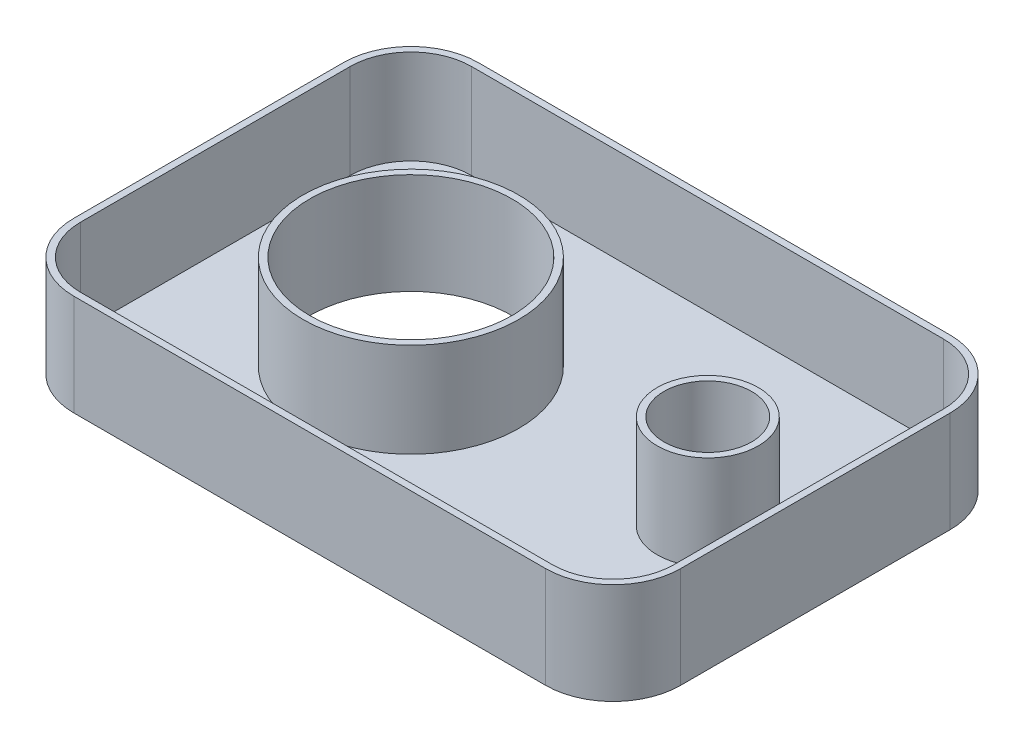
ISO-10303-21;
HEADER;
FILE_DESCRIPTION(('STEP AP214'),'2;1');
FILE_NAME('part.step','',(''),(''),'','','');
FILE_SCHEMA(('AUTOMOTIVE_DESIGN { 1 0 10303 214 1 1 1 1 }'));
ENDSEC;
DATA;
#1=APPLICATION_CONTEXT('core data for automotive mechanical design processes');
#2=APPLICATION_PROTOCOL_DEFINITION('international standard','automotive_design',2000,#1);
#3=PRODUCT_CONTEXT('',#1,'mechanical');
#4=PRODUCT('Part','Part','',(#3));
#5=PRODUCT_RELATED_PRODUCT_CATEGORY('part','',(#4));
#6=PRODUCT_DEFINITION_FORMATION('','',#4);
#7=PRODUCT_DEFINITION_CONTEXT('part definition',#1,'design');
#8=PRODUCT_DEFINITION('design','',#6,#7);
#9=PRODUCT_DEFINITION_SHAPE('','',#8);
#10=(LENGTH_UNIT() NAMED_UNIT(*) SI_UNIT(.MILLI.,.METRE.));
#11=(NAMED_UNIT(*) PLANE_ANGLE_UNIT() SI_UNIT($,.RADIAN.));
#12=(NAMED_UNIT(*) SI_UNIT($,.STERADIAN.) SOLID_ANGLE_UNIT());
#13=UNCERTAINTY_MEASURE_WITH_UNIT(LENGTH_MEASURE(1.E-05),#10,'distance_accuracy_value','');
#14=(GEOMETRIC_REPRESENTATION_CONTEXT(3) GLOBAL_UNCERTAINTY_ASSIGNED_CONTEXT((#13)) GLOBAL_UNIT_ASSIGNED_CONTEXT((#10,
#11,#12)) REPRESENTATION_CONTEXT('',''));
#15=CARTESIAN_POINT('',(0.,0.,0.));
#16=DIRECTION('',(0.,0.,1.));
#17=DIRECTION('',(1.,0.,0.));
#18=AXIS2_PLACEMENT_3D('',#15,#16,#17);
#19=CARTESIAN_POINT('',(0.,30.,0.));
#20=DIRECTION('',(0.,1.,0.));
#21=DIRECTION('',(0.,0.,1.));
#22=AXIS2_PLACEMENT_3D('',#19,#20,#21);
#23=PLANE('',#22);
#24=CARTESIAN_POINT('',(60.,30.,60.));
#25=DIRECTION('',(0.,1.,0.));
#26=DIRECTION('',(0.,0.,1.));
#27=AXIS2_PLACEMENT_3D('',#24,#25,#26);
#28=CIRCLE('',#27,30.);
#29=CARTESIAN_POINT('',(60.,30.,90.));
#30=VERTEX_POINT('',#29);
#31=EDGE_CURVE('E275',#30,#30,#28,.T.);
#32=ORIENTED_EDGE('',*,*,#31,.F.);
#33=EDGE_LOOP('',(#32));
#34=FACE_BOUND('',#33,.T.);
#35=CARTESIAN_POINT('',(60.,30.,60.));
#36=DIRECTION('',(0.,1.,0.));
#37=DIRECTION('',(0.,0.,1.));
#38=AXIS2_PLACEMENT_3D('',#35,#36,#37);
#39=CIRCLE('',#38,32.);
#40=CARTESIAN_POINT('',(60.,30.,92.));
#41=VERTEX_POINT('',#40);
#42=EDGE_CURVE('E201',#41,#41,#39,.T.);
#43=ORIENTED_EDGE('',*,*,#42,.T.);
#44=EDGE_LOOP('',(#43));
#45=FACE_BOUND('',#44,.T.);
#46=ADVANCED_FACE('F43',(#34,#45),#23,.T.);
#47=CARTESIAN_POINT('',(145.,30.,56.9263633620725));
#48=DIRECTION('',(0.,1.,0.));
#49=DIRECTION('',(0.,0.,1.));
#50=AXIS2_PLACEMENT_3D('',#47,#48,#49);
#51=CIRCLE('',#50,13.);
#52=CARTESIAN_POINT('',(145.,30.,69.9263633620725));
#53=VERTEX_POINT('',#52);
#54=EDGE_CURVE('E279',#53,#53,#51,.T.);
#55=ORIENTED_EDGE('',*,*,#54,.F.);
#56=EDGE_LOOP('',(#55));
#57=FACE_BOUND('',#56,.T.);
#58=CARTESIAN_POINT('',(145.,30.,56.9263633620725));
#59=DIRECTION('',(0.,1.,0.));
#60=DIRECTION('',(0.,0.,1.));
#61=AXIS2_PLACEMENT_3D('',#58,#59,#60);
#62=CIRCLE('',#61,15.);
#63=CARTESIAN_POINT('',(145.,30.,71.9263633620725));
#64=VERTEX_POINT('',#63);
#65=EDGE_CURVE('E206',#64,#64,#62,.T.);
#66=ORIENTED_EDGE('',*,*,#65,.T.);
#67=EDGE_LOOP('',(#66));
#68=FACE_BOUND('',#67,.T.);
#69=ADVANCED_FACE('F404',(#57,#68),#23,.T.);
#70=CARTESIAN_POINT('',(0.,30.,0.));
#71=DIRECTION('',(1.,0.,0.));
#72=DIRECTION('',(0.,0.,-1.));
#73=AXIS2_PLACEMENT_3D('',#70,#71,#72);
#74=PLANE('',#73);
#75=DIRECTION('',(0.,0.,1.));
#76=VECTOR('',#75,1.);
#77=CARTESIAN_POINT('',(0.,0.,0.));
#78=LINE('',#77,#76);
#79=CARTESIAN_POINT('',(0.,0.,20.));
#80=VERTEX_POINT('',#79);
#81=CARTESIAN_POINT('',(0.,0.,100.));
#82=VERTEX_POINT('',#81);
#83=EDGE_CURVE('E274',#80,#82,#78,.T.);
#84=ORIENTED_EDGE('',*,*,#83,.T.);
#85=DIRECTION('',(0.,-1.,0.));
#86=VECTOR('',#85,1.);
#87=CARTESIAN_POINT('',(0.,30.,100.));
#88=LINE('',#87,#86);
#89=CARTESIAN_POINT('',(0.,30.,100.));
#90=VERTEX_POINT('',#89);
#91=EDGE_CURVE('E338',#82,#90,#88,.F.);
#92=ORIENTED_EDGE('',*,*,#91,.T.);
#93=DIRECTION('',(0.,0.,1.));
#94=VECTOR('',#93,1.);
#95=CARTESIAN_POINT('',(0.,30.,0.));
#96=LINE('',#95,#94);
#97=CARTESIAN_POINT('',(0.,30.,20.));
#98=VERTEX_POINT('',#97);
#99=EDGE_CURVE('E286',#98,#90,#96,.T.);
#100=ORIENTED_EDGE('',*,*,#99,.F.);
#101=DIRECTION('',(0.,-1.,0.));
#102=VECTOR('',#101,1.);
#103=CARTESIAN_POINT('',(0.,30.,20.));
#104=LINE('',#103,#102);
#105=EDGE_CURVE('E334',#98,#80,#104,.T.);
#106=ORIENTED_EDGE('',*,*,#105,.T.);
#107=EDGE_LOOP('',(#84,#92,#100,#106));
#108=FACE_BOUND('',#107,.T.);
#109=ADVANCED_FACE('F386',(#108),#74,.F.);
#110=CARTESIAN_POINT('',(0.,30.,120.));
#111=DIRECTION('',(0.,0.,-1.));
#112=DIRECTION('',(-1.,0.,0.));
#113=AXIS2_PLACEMENT_3D('',#110,#111,#112);
#114=PLANE('',#113);
#115=DIRECTION('',(1.,0.,0.));
#116=VECTOR('',#115,1.);
#117=CARTESIAN_POINT('',(0.,30.,120.));
#118=LINE('',#117,#116);
#119=CARTESIAN_POINT('',(20.,30.,120.));
#120=VERTEX_POINT('',#119);
#121=CARTESIAN_POINT('',(160.,30.,120.));
#122=VERTEX_POINT('',#121);
#123=EDGE_CURVE('E290',#120,#122,#118,.T.);
#124=ORIENTED_EDGE('',*,*,#123,.F.);
#125=DIRECTION('',(0.,-1.,0.));
#126=VECTOR('',#125,1.);
#127=CARTESIAN_POINT('',(20.,30.,120.));
#128=LINE('',#127,#126);
#129=CARTESIAN_POINT('',(20.,0.,120.));
#130=VERTEX_POINT('',#129);
#131=EDGE_CURVE('E318',#120,#130,#128,.T.);
#132=ORIENTED_EDGE('',*,*,#131,.T.);
#133=DIRECTION('',(1.,0.,0.));
#134=VECTOR('',#133,1.);
#135=CARTESIAN_POINT('',(0.,0.,120.));
#136=LINE('',#135,#134);
#137=CARTESIAN_POINT('',(160.,0.,120.));
#138=VERTEX_POINT('',#137);
#139=EDGE_CURVE('E306',#130,#138,#136,.T.);
#140=ORIENTED_EDGE('',*,*,#139,.T.);
#141=DIRECTION('',(0.,-1.,0.));
#142=VECTOR('',#141,1.);
#143=CARTESIAN_POINT('',(160.,30.,120.));
#144=LINE('',#143,#142);
#145=EDGE_CURVE('E302',#138,#122,#144,.F.);
#146=ORIENTED_EDGE('',*,*,#145,.T.);
#147=EDGE_LOOP('',(#124,#132,#140,#146));
#148=FACE_BOUND('',#147,.T.);
#149=ADVANCED_FACE('F394',(#148),#114,.F.);
#150=CARTESIAN_POINT('',(180.,30.,0.));
#151=DIRECTION('',(-1.,0.,0.));
#152=DIRECTION('',(0.,0.,1.));
#153=AXIS2_PLACEMENT_3D('',#150,#151,#152);
#154=PLANE('',#153);
#155=DIRECTION('',(0.,0.,-1.));
#156=VECTOR('',#155,1.);
#157=CARTESIAN_POINT('',(180.,0.,0.));
#158=LINE('',#157,#156);
#159=CARTESIAN_POINT('',(180.,0.,100.));
#160=VERTEX_POINT('',#159);
#161=CARTESIAN_POINT('',(180.,0.,20.));
#162=VERTEX_POINT('',#161);
#163=EDGE_CURVE('E310',#160,#162,#158,.T.);
#164=ORIENTED_EDGE('',*,*,#163,.T.);
#165=DIRECTION('',(0.,-1.,0.));
#166=VECTOR('',#165,1.);
#167=CARTESIAN_POINT('',(180.,30.,20.));
#168=LINE('',#167,#166);
#169=CARTESIAN_POINT('',(180.,30.,20.));
#170=VERTEX_POINT('',#169);
#171=EDGE_CURVE('E11',#162,#170,#168,.F.);
#172=ORIENTED_EDGE('',*,*,#171,.T.);
#173=DIRECTION('',(0.,0.,-1.));
#174=VECTOR('',#173,1.);
#175=CARTESIAN_POINT('',(180.,30.,0.));
#176=LINE('',#175,#174);
#177=CARTESIAN_POINT('',(180.,30.,100.));
#178=VERTEX_POINT('',#177);
#179=EDGE_CURVE('E295',#178,#170,#176,.T.);
#180=ORIENTED_EDGE('',*,*,#179,.F.);
#181=DIRECTION('',(0.,-1.,0.));
#182=VECTOR('',#181,1.);
#183=CARTESIAN_POINT('',(180.,30.,100.));
#184=LINE('',#183,#182);
#185=EDGE_CURVE('E52',#178,#160,#184,.T.);
#186=ORIENTED_EDGE('',*,*,#185,.T.);
#187=EDGE_LOOP('',(#164,#172,#180,#186));
#188=FACE_BOUND('',#187,.T.);
#189=ADVANCED_FACE('F364',(#188),#154,.F.);
#190=CARTESIAN_POINT('',(0.,30.,0.));
#191=DIRECTION('',(0.,0.,1.));
#192=DIRECTION('',(1.,0.,0.));
#193=AXIS2_PLACEMENT_3D('',#190,#191,#192);
#194=PLANE('',#193);
#195=DIRECTION('',(-1.,0.,0.));
#196=VECTOR('',#195,1.);
#197=CARTESIAN_POINT('',(0.,0.,0.));
#198=LINE('',#197,#196);
#199=CARTESIAN_POINT('',(160.,0.,0.));
#200=VERTEX_POINT('',#199);
#201=CARTESIAN_POINT('',(20.,0.,0.));
#202=VERTEX_POINT('',#201);
#203=EDGE_CURVE('E291',#200,#202,#198,.T.);
#204=ORIENTED_EDGE('',*,*,#203,.T.);
#205=DIRECTION('',(0.,-1.,0.));
#206=VECTOR('',#205,1.);
#207=CARTESIAN_POINT('',(20.,30.,0.));
#208=LINE('',#207,#206);
#209=CARTESIAN_POINT('',(20.,30.,0.));
#210=VERTEX_POINT('',#209);
#211=EDGE_CURVE('E67',#202,#210,#208,.F.);
#212=ORIENTED_EDGE('',*,*,#211,.T.);
#213=DIRECTION('',(-1.,0.,0.));
#214=VECTOR('',#213,1.);
#215=CARTESIAN_POINT('',(0.,30.,0.));
#216=LINE('',#215,#214);
#217=CARTESIAN_POINT('',(160.,30.,0.));
#218=VERTEX_POINT('',#217);
#219=EDGE_CURVE('E299',#218,#210,#216,.T.);
#220=ORIENTED_EDGE('',*,*,#219,.F.);
#221=DIRECTION('',(0.,-1.,0.));
#222=VECTOR('',#221,1.);
#223=CARTESIAN_POINT('',(160.,30.,0.));
#224=LINE('',#223,#222);
#225=EDGE_CURVE('E353',#218,#200,#224,.T.);
#226=ORIENTED_EDGE('',*,*,#225,.T.);
#227=EDGE_LOOP('',(#204,#212,#220,#226));
#228=FACE_BOUND('',#227,.T.);
#229=ADVANCED_FACE('F376',(#228),#194,.F.);
#230=DIRECTION('',(0.,0.,1.));
#231=VECTOR('',#230,1.);
#232=CARTESIAN_POINT('',(2.,30.,0.));
#233=LINE('',#232,#231);
#234=CARTESIAN_POINT('',(2.,30.,20.));
#235=VERTEX_POINT('',#234);
#236=CARTESIAN_POINT('',(2.,30.,100.));
#237=VERTEX_POINT('',#236);
#238=EDGE_CURVE('E187',#235,#237,#233,.T.);
#239=ORIENTED_EDGE('',*,*,#238,.F.);
#240=CARTESIAN_POINT('',(20.,30.,20.));
#241=DIRECTION('',(0.,1.,0.));
#242=DIRECTION('',(0.,0.,1.));
#243=AXIS2_PLACEMENT_3D('',#240,#241,#242);
#244=CIRCLE('',#243,18.);
#245=CARTESIAN_POINT('',(20.,30.,2.));
#246=VERTEX_POINT('',#245);
#247=EDGE_CURVE('E250',#246,#235,#244,.T.);
#248=ORIENTED_EDGE('',*,*,#247,.F.);
#249=DIRECTION('',(-1.,0.,0.));
#250=VECTOR('',#249,1.);
#251=CARTESIAN_POINT('',(0.,30.,2.));
#252=LINE('',#251,#250);
#253=CARTESIAN_POINT('',(160.,30.,2.));
#254=VERTEX_POINT('',#253);
#255=EDGE_CURVE('E59',#254,#246,#252,.T.);
#256=ORIENTED_EDGE('',*,*,#255,.F.);
#257=CARTESIAN_POINT('',(160.,30.,20.));
#258=DIRECTION('',(0.,1.,0.));
#259=DIRECTION('',(0.,0.,1.));
#260=AXIS2_PLACEMENT_3D('',#257,#258,#259);
#261=CIRCLE('',#260,18.);
#262=CARTESIAN_POINT('',(178.,30.,20.));
#263=VERTEX_POINT('',#262);
#264=EDGE_CURVE('E194',#263,#254,#261,.T.);
#265=ORIENTED_EDGE('',*,*,#264,.F.);
#266=DIRECTION('',(0.,0.,-1.));
#267=VECTOR('',#266,1.);
#268=CARTESIAN_POINT('',(178.,30.,0.));
#269=LINE('',#268,#267);
#270=CARTESIAN_POINT('',(178.,30.,100.));
#271=VERTEX_POINT('',#270);
#272=EDGE_CURVE('E253',#271,#263,#269,.T.);
#273=ORIENTED_EDGE('',*,*,#272,.F.);
#274=CARTESIAN_POINT('',(160.,30.,100.));
#275=DIRECTION('',(0.,1.,0.));
#276=DIRECTION('',(0.,0.,1.));
#277=AXIS2_PLACEMENT_3D('',#274,#275,#276);
#278=CIRCLE('',#277,18.);
#279=CARTESIAN_POINT('',(160.,30.,118.));
#280=VERTEX_POINT('',#279);
#281=EDGE_CURVE('E190',#280,#271,#278,.T.);
#282=ORIENTED_EDGE('',*,*,#281,.F.);
#283=DIRECTION('',(1.,0.,0.));
#284=VECTOR('',#283,1.);
#285=CARTESIAN_POINT('',(0.,30.,118.));
#286=LINE('',#285,#284);
#287=CARTESIAN_POINT('',(20.,30.,118.));
#288=VERTEX_POINT('',#287);
#289=EDGE_CURVE('E247',#288,#280,#286,.T.);
#290=ORIENTED_EDGE('',*,*,#289,.F.);
#291=CARTESIAN_POINT('',(20.,30.,100.));
#292=DIRECTION('',(0.,1.,0.));
#293=DIRECTION('',(0.,0.,1.));
#294=AXIS2_PLACEMENT_3D('',#291,#292,#293);
#295=CIRCLE('',#294,18.);
#296=EDGE_CURVE('E242',#237,#288,#295,.T.);
#297=ORIENTED_EDGE('',*,*,#296,.F.);
#298=EDGE_LOOP('',(#239,#248,#256,#265,#273,#282,#290,#297));
#299=FACE_BOUND('',#298,.T.);
#300=ORIENTED_EDGE('',*,*,#99,.T.);
#301=CARTESIAN_POINT('',(20.,30.,100.));
#302=DIRECTION('',(0.,1.,0.));
#303=DIRECTION('',(0.,0.,1.));
#304=AXIS2_PLACEMENT_3D('',#301,#302,#303);
#305=CIRCLE('',#304,20.);
#306=EDGE_CURVE('E350',#90,#120,#305,.T.);
#307=ORIENTED_EDGE('',*,*,#306,.T.);
#308=ORIENTED_EDGE('',*,*,#123,.T.);
#309=CARTESIAN_POINT('',(160.,30.,100.));
#310=DIRECTION('',(0.,1.,0.));
#311=DIRECTION('',(0.,0.,1.));
#312=AXIS2_PLACEMENT_3D('',#309,#310,#311);
#313=CIRCLE('',#312,20.);
#314=EDGE_CURVE('E341',#122,#178,#313,.T.);
#315=ORIENTED_EDGE('',*,*,#314,.T.);
#316=ORIENTED_EDGE('',*,*,#179,.T.);
#317=CARTESIAN_POINT('',(160.,30.,20.));
#318=DIRECTION('',(0.,1.,0.));
#319=DIRECTION('',(0.,0.,1.));
#320=AXIS2_PLACEMENT_3D('',#317,#318,#319);
#321=CIRCLE('',#320,20.);
#322=EDGE_CURVE('E344',#170,#218,#321,.T.);
#323=ORIENTED_EDGE('',*,*,#322,.T.);
#324=ORIENTED_EDGE('',*,*,#219,.T.);
#325=CARTESIAN_POINT('',(20.,30.,20.));
#326=DIRECTION('',(0.,1.,0.));
#327=DIRECTION('',(0.,0.,1.));
#328=AXIS2_PLACEMENT_3D('',#325,#326,#327);
#329=CIRCLE('',#328,20.);
#330=EDGE_CURVE('E347',#210,#98,#329,.T.);
#331=ORIENTED_EDGE('',*,*,#330,.T.);
#332=EDGE_LOOP('',(#300,#307,#308,#315,#316,#323,#324,#331));
#333=FACE_BOUND('',#332,.T.);
#334=ADVANCED_FACE('F379',(#299,#333),#23,.T.);
#335=CARTESIAN_POINT('',(0.,0.,0.));
#336=DIRECTION('',(0.,1.,0.));
#337=DIRECTION('',(0.,0.,1.));
#338=AXIS2_PLACEMENT_3D('',#335,#336,#337);
#339=PLANE('',#338);
#340=CARTESIAN_POINT('',(60.,0.,60.));
#341=DIRECTION('',(0.,1.,0.));
#342=DIRECTION('',(0.,0.,1.));
#343=AXIS2_PLACEMENT_3D('',#340,#341,#342);
#344=CIRCLE('',#343,30.);
#345=CARTESIAN_POINT('',(60.,0.,90.));
#346=VERTEX_POINT('',#345);
#347=EDGE_CURVE('E270',#346,#346,#344,.T.);
#348=ORIENTED_EDGE('',*,*,#347,.T.);
#349=EDGE_LOOP('',(#348));
#350=FACE_BOUND('',#349,.T.);
#351=CARTESIAN_POINT('',(145.,0.,56.9263633620725));
#352=DIRECTION('',(0.,1.,0.));
#353=DIRECTION('',(0.,0.,1.));
#354=AXIS2_PLACEMENT_3D('',#351,#352,#353);
#355=CIRCLE('',#354,13.);
#356=CARTESIAN_POINT('',(145.,0.,69.9263633620725));
#357=VERTEX_POINT('',#356);
#358=EDGE_CURVE('E237',#357,#357,#355,.T.);
#359=ORIENTED_EDGE('',*,*,#358,.T.);
#360=EDGE_LOOP('',(#359));
#361=FACE_BOUND('',#360,.T.);
#362=ORIENTED_EDGE('',*,*,#139,.F.);
#363=CARTESIAN_POINT('',(20.,0.,100.));
#364=DIRECTION('',(0.,1.,0.));
#365=DIRECTION('',(0.,0.,1.));
#366=AXIS2_PLACEMENT_3D('',#363,#364,#365);
#367=CIRCLE('',#366,20.);
#368=EDGE_CURVE('E331',#130,#82,#367,.F.);
#369=ORIENTED_EDGE('',*,*,#368,.T.);
#370=ORIENTED_EDGE('',*,*,#83,.F.);
#371=CARTESIAN_POINT('',(20.,0.,20.));
#372=DIRECTION('',(0.,1.,0.));
#373=DIRECTION('',(0.,0.,1.));
#374=AXIS2_PLACEMENT_3D('',#371,#372,#373);
#375=CIRCLE('',#374,20.);
#376=EDGE_CURVE('E328',#80,#202,#375,.F.);
#377=ORIENTED_EDGE('',*,*,#376,.T.);
#378=ORIENTED_EDGE('',*,*,#203,.F.);
#379=CARTESIAN_POINT('',(160.,0.,20.));
#380=DIRECTION('',(0.,1.,0.));
#381=DIRECTION('',(0.,0.,1.));
#382=AXIS2_PLACEMENT_3D('',#379,#380,#381);
#383=CIRCLE('',#382,20.);
#384=EDGE_CURVE('E325',#200,#162,#383,.F.);
#385=ORIENTED_EDGE('',*,*,#384,.T.);
#386=ORIENTED_EDGE('',*,*,#163,.F.);
#387=CARTESIAN_POINT('',(160.,0.,100.));
#388=DIRECTION('',(0.,1.,0.));
#389=DIRECTION('',(0.,0.,1.));
#390=AXIS2_PLACEMENT_3D('',#387,#388,#389);
#391=CIRCLE('',#390,20.);
#392=EDGE_CURVE('E322',#160,#138,#391,.F.);
#393=ORIENTED_EDGE('',*,*,#392,.T.);
#394=EDGE_LOOP('',(#362,#369,#370,#377,#378,#385,#386,#393));
#395=FACE_BOUND('',#394,.T.);
#396=ADVANCED_FACE('F370',(#350,#361,#395),#339,.F.);
#397=CARTESIAN_POINT('',(145.,0.,56.9263633620725));
#398=DIRECTION('',(0.,1.,0.));
#399=DIRECTION('',(0.,0.,1.));
#400=AXIS2_PLACEMENT_3D('',#397,#398,#399);
#401=CYLINDRICAL_SURFACE('',#400,13.);
#402=ORIENTED_EDGE('',*,*,#358,.F.);
#403=EDGE_LOOP('',(#402));
#404=FACE_BOUND('',#403,.T.);
#405=ORIENTED_EDGE('',*,*,#54,.T.);
#406=EDGE_LOOP('',(#405));
#407=FACE_BOUND('',#406,.T.);
#408=ADVANCED_FACE('F421',(#404,#407),#401,.F.);
#409=CARTESIAN_POINT('',(60.,0.,60.));
#410=DIRECTION('',(0.,1.,0.));
#411=DIRECTION('',(0.,0.,1.));
#412=AXIS2_PLACEMENT_3D('',#409,#410,#411);
#413=CYLINDRICAL_SURFACE('',#412,30.);
#414=ORIENTED_EDGE('',*,*,#347,.F.);
#415=EDGE_LOOP('',(#414));
#416=FACE_BOUND('',#415,.T.);
#417=ORIENTED_EDGE('',*,*,#31,.T.);
#418=EDGE_LOOP('',(#417));
#419=FACE_BOUND('',#418,.T.);
#420=ADVANCED_FACE('F457',(#416,#419),#413,.F.);
#421=CARTESIAN_POINT('',(20.,30.,100.));
#422=DIRECTION('',(0.,-1.,0.));
#423=DIRECTION('',(0.,0.,-1.));
#424=AXIS2_PLACEMENT_3D('',#421,#422,#423);
#425=CYLINDRICAL_SURFACE('',#424,20.);
#426=ORIENTED_EDGE('',*,*,#306,.F.);
#427=ORIENTED_EDGE('',*,*,#91,.F.);
#428=ORIENTED_EDGE('',*,*,#368,.F.);
#429=ORIENTED_EDGE('',*,*,#131,.F.);
#430=EDGE_LOOP('',(#426,#427,#428,#429));
#431=FACE_BOUND('',#430,.T.);
#432=ADVANCED_FACE('F391',(#431),#425,.T.);
#433=CARTESIAN_POINT('',(20.,30.,20.));
#434=DIRECTION('',(0.,-1.,0.));
#435=DIRECTION('',(0.,0.,-1.));
#436=AXIS2_PLACEMENT_3D('',#433,#434,#435);
#437=CYLINDRICAL_SURFACE('',#436,20.);
#438=ORIENTED_EDGE('',*,*,#330,.F.);
#439=ORIENTED_EDGE('',*,*,#211,.F.);
#440=ORIENTED_EDGE('',*,*,#376,.F.);
#441=ORIENTED_EDGE('',*,*,#105,.F.);
#442=EDGE_LOOP('',(#438,#439,#440,#441));
#443=FACE_BOUND('',#442,.T.);
#444=ADVANCED_FACE('F383',(#443),#437,.T.);
#445=CARTESIAN_POINT('',(160.,30.,20.));
#446=DIRECTION('',(0.,-1.,0.));
#447=DIRECTION('',(0.,0.,-1.));
#448=AXIS2_PLACEMENT_3D('',#445,#446,#447);
#449=CYLINDRICAL_SURFACE('',#448,20.);
#450=ORIENTED_EDGE('',*,*,#322,.F.);
#451=ORIENTED_EDGE('',*,*,#171,.F.);
#452=ORIENTED_EDGE('',*,*,#384,.F.);
#453=ORIENTED_EDGE('',*,*,#225,.F.);
#454=EDGE_LOOP('',(#450,#451,#452,#453));
#455=FACE_BOUND('',#454,.T.);
#456=ADVANCED_FACE('F375',(#455),#449,.T.);
#457=CARTESIAN_POINT('',(160.,30.,100.));
#458=DIRECTION('',(0.,-1.,0.));
#459=DIRECTION('',(0.,0.,-1.));
#460=AXIS2_PLACEMENT_3D('',#457,#458,#459);
#461=CYLINDRICAL_SURFACE('',#460,20.);
#462=ORIENTED_EDGE('',*,*,#314,.F.);
#463=ORIENTED_EDGE('',*,*,#145,.F.);
#464=ORIENTED_EDGE('',*,*,#392,.F.);
#465=ORIENTED_EDGE('',*,*,#185,.F.);
#466=EDGE_LOOP('',(#462,#463,#464,#465));
#467=FACE_BOUND('',#466,.T.);
#468=ADVANCED_FACE('F45',(#467),#461,.T.);
#469=CARTESIAN_POINT('',(2.,30.,0.));
#470=DIRECTION('',(1.,0.,0.));
#471=DIRECTION('',(0.,0.,-1.));
#472=AXIS2_PLACEMENT_3D('',#469,#470,#471);
#473=PLANE('',#472);
#474=DIRECTION('',(0.,0.,1.));
#475=VECTOR('',#474,1.);
#476=CARTESIAN_POINT('',(2.,2.,0.));
#477=LINE('',#476,#475);
#478=CARTESIAN_POINT('',(2.,2.,20.));
#479=VERTEX_POINT('',#478);
#480=CARTESIAN_POINT('',(2.,2.,100.));
#481=VERTEX_POINT('',#480);
#482=EDGE_CURVE('E175',#479,#481,#477,.T.);
#483=ORIENTED_EDGE('',*,*,#482,.F.);
#484=DIRECTION('',(0.,1.,0.));
#485=VECTOR('',#484,1.);
#486=CARTESIAN_POINT('',(2.,30.,20.));
#487=LINE('',#486,#485);
#488=EDGE_CURVE('E171',#235,#479,#487,.F.);
#489=ORIENTED_EDGE('',*,*,#488,.F.);
#490=ORIENTED_EDGE('',*,*,#238,.T.);
#491=DIRECTION('',(0.,1.,0.));
#492=VECTOR('',#491,1.);
#493=CARTESIAN_POINT('',(2.,30.,100.));
#494=LINE('',#493,#492);
#495=EDGE_CURVE('E163',#481,#237,#494,.T.);
#496=ORIENTED_EDGE('',*,*,#495,.F.);
#497=EDGE_LOOP('',(#483,#489,#490,#496));
#498=FACE_BOUND('',#497,.T.);
#499=ADVANCED_FACE('F185',(#498),#473,.T.);
#500=CARTESIAN_POINT('',(0.,30.,118.));
#501=DIRECTION('',(0.,0.,-1.));
#502=DIRECTION('',(-1.,0.,0.));
#503=AXIS2_PLACEMENT_3D('',#500,#501,#502);
#504=PLANE('',#503);
#505=ORIENTED_EDGE('',*,*,#289,.T.);
#506=DIRECTION('',(0.,1.,0.));
#507=VECTOR('',#506,1.);
#508=CARTESIAN_POINT('',(160.,30.,118.));
#509=LINE('',#508,#507);
#510=CARTESIAN_POINT('',(160.,2.,118.));
#511=VERTEX_POINT('',#510);
#512=EDGE_CURVE('E226',#511,#280,#509,.T.);
#513=ORIENTED_EDGE('',*,*,#512,.F.);
#514=DIRECTION('',(1.,0.,0.));
#515=VECTOR('',#514,1.);
#516=CARTESIAN_POINT('',(0.,2.,118.));
#517=LINE('',#516,#515);
#518=CARTESIAN_POINT('',(20.,2.,118.));
#519=VERTEX_POINT('',#518);
#520=EDGE_CURVE('E182',#519,#511,#517,.T.);
#521=ORIENTED_EDGE('',*,*,#520,.F.);
#522=DIRECTION('',(0.,1.,0.));
#523=VECTOR('',#522,1.);
#524=CARTESIAN_POINT('',(20.,30.,118.));
#525=LINE('',#524,#523);
#526=EDGE_CURVE('E166',#288,#519,#525,.F.);
#527=ORIENTED_EDGE('',*,*,#526,.F.);
#528=EDGE_LOOP('',(#505,#513,#521,#527));
#529=FACE_BOUND('',#528,.T.);
#530=ADVANCED_FACE('F401',(#529),#504,.T.);
#531=CARTESIAN_POINT('',(178.,30.,0.));
#532=DIRECTION('',(-1.,0.,0.));
#533=DIRECTION('',(0.,0.,1.));
#534=AXIS2_PLACEMENT_3D('',#531,#532,#533);
#535=PLANE('',#534);
#536=DIRECTION('',(0.,0.,-1.));
#537=VECTOR('',#536,1.);
#538=CARTESIAN_POINT('',(178.,2.,0.));
#539=LINE('',#538,#537);
#540=CARTESIAN_POINT('',(178.,2.,100.));
#541=VERTEX_POINT('',#540);
#542=CARTESIAN_POINT('',(178.,2.,20.));
#543=VERTEX_POINT('',#542);
#544=EDGE_CURVE('E208',#541,#543,#539,.T.);
#545=ORIENTED_EDGE('',*,*,#544,.F.);
#546=DIRECTION('',(0.,1.,0.));
#547=VECTOR('',#546,1.);
#548=CARTESIAN_POINT('',(178.,30.,100.));
#549=LINE('',#548,#547);
#550=EDGE_CURVE('E229',#271,#541,#549,.F.);
#551=ORIENTED_EDGE('',*,*,#550,.F.);
#552=ORIENTED_EDGE('',*,*,#272,.T.);
#553=DIRECTION('',(0.,1.,0.));
#554=VECTOR('',#553,1.);
#555=CARTESIAN_POINT('',(178.,30.,20.));
#556=LINE('',#555,#554);
#557=EDGE_CURVE('E233',#543,#263,#556,.T.);
#558=ORIENTED_EDGE('',*,*,#557,.F.);
#559=EDGE_LOOP('',(#545,#551,#552,#558));
#560=FACE_BOUND('',#559,.T.);
#561=ADVANCED_FACE('F436',(#560),#535,.T.);
#562=CARTESIAN_POINT('',(0.,30.,2.));
#563=DIRECTION('',(0.,0.,1.));
#564=DIRECTION('',(1.,0.,0.));
#565=AXIS2_PLACEMENT_3D('',#562,#563,#564);
#566=PLANE('',#565);
#567=DIRECTION('',(-1.,0.,0.));
#568=VECTOR('',#567,1.);
#569=CARTESIAN_POINT('',(0.,2.,2.));
#570=LINE('',#569,#568);
#571=CARTESIAN_POINT('',(160.,2.,2.));
#572=VERTEX_POINT('',#571);
#573=CARTESIAN_POINT('',(20.,2.,2.));
#574=VERTEX_POINT('',#573);
#575=EDGE_CURVE('E213',#572,#574,#570,.T.);
#576=ORIENTED_EDGE('',*,*,#575,.F.);
#577=DIRECTION('',(0.,1.,0.));
#578=VECTOR('',#577,1.);
#579=CARTESIAN_POINT('',(160.,30.,2.));
#580=LINE('',#579,#578);
#581=EDGE_CURVE('E238',#254,#572,#580,.F.);
#582=ORIENTED_EDGE('',*,*,#581,.F.);
#583=ORIENTED_EDGE('',*,*,#255,.T.);
#584=DIRECTION('',(0.,1.,0.));
#585=VECTOR('',#584,1.);
#586=CARTESIAN_POINT('',(20.,30.,2.));
#587=LINE('',#586,#585);
#588=EDGE_CURVE('E234',#574,#246,#587,.T.);
#589=ORIENTED_EDGE('',*,*,#588,.F.);
#590=EDGE_LOOP('',(#576,#582,#583,#589));
#591=FACE_BOUND('',#590,.T.);
#592=ADVANCED_FACE('F441',(#591),#566,.T.);
#593=CARTESIAN_POINT('',(0.,2.,0.));
#594=DIRECTION('',(0.,1.,0.));
#595=DIRECTION('',(0.,0.,1.));
#596=AXIS2_PLACEMENT_3D('',#593,#594,#595);
#597=PLANE('',#596);
#598=CARTESIAN_POINT('',(60.,2.,60.));
#599=DIRECTION('',(0.,1.,0.));
#600=DIRECTION('',(0.,0.,1.));
#601=AXIS2_PLACEMENT_3D('',#598,#599,#600);
#602=CIRCLE('',#601,32.);
#603=CARTESIAN_POINT('',(60.,2.,92.));
#604=VERTEX_POINT('',#603);
#605=EDGE_CURVE('E183',#604,#604,#602,.T.);
#606=ORIENTED_EDGE('',*,*,#605,.F.);
#607=EDGE_LOOP('',(#606));
#608=FACE_BOUND('',#607,.T.);
#609=CARTESIAN_POINT('',(145.,2.,56.9263633620725));
#610=DIRECTION('',(0.,1.,0.));
#611=DIRECTION('',(0.,0.,1.));
#612=AXIS2_PLACEMENT_3D('',#609,#610,#611);
#613=CIRCLE('',#612,15.);
#614=CARTESIAN_POINT('',(145.,2.,71.9263633620725));
#615=VERTEX_POINT('',#614);
#616=EDGE_CURVE('E202',#615,#615,#613,.T.);
#617=ORIENTED_EDGE('',*,*,#616,.F.);
#618=EDGE_LOOP('',(#617));
#619=FACE_BOUND('',#618,.T.);
#620=ORIENTED_EDGE('',*,*,#520,.T.);
#621=CARTESIAN_POINT('',(160.,2.,100.));
#622=DIRECTION('',(0.,1.,0.));
#623=DIRECTION('',(0.,0.,1.));
#624=AXIS2_PLACEMENT_3D('',#621,#622,#623);
#625=CIRCLE('',#624,18.);
#626=EDGE_CURVE('E218',#541,#511,#625,.F.);
#627=ORIENTED_EDGE('',*,*,#626,.F.);
#628=ORIENTED_EDGE('',*,*,#544,.T.);
#629=CARTESIAN_POINT('',(160.,2.,20.));
#630=DIRECTION('',(0.,1.,0.));
#631=DIRECTION('',(0.,0.,1.));
#632=AXIS2_PLACEMENT_3D('',#629,#630,#631);
#633=CIRCLE('',#632,18.);
#634=EDGE_CURVE('E212',#572,#543,#633,.F.);
#635=ORIENTED_EDGE('',*,*,#634,.F.);
#636=ORIENTED_EDGE('',*,*,#575,.T.);
#637=CARTESIAN_POINT('',(20.,2.,20.));
#638=DIRECTION('',(0.,1.,0.));
#639=DIRECTION('',(0.,0.,1.));
#640=AXIS2_PLACEMENT_3D('',#637,#638,#639);
#641=CIRCLE('',#640,18.);
#642=EDGE_CURVE('E172',#479,#574,#641,.F.);
#643=ORIENTED_EDGE('',*,*,#642,.F.);
#644=ORIENTED_EDGE('',*,*,#482,.T.);
#645=CARTESIAN_POINT('',(20.,2.,100.));
#646=DIRECTION('',(0.,1.,0.));
#647=DIRECTION('',(0.,0.,1.));
#648=AXIS2_PLACEMENT_3D('',#645,#646,#647);
#649=CIRCLE('',#648,18.);
#650=EDGE_CURVE('E159',#519,#481,#649,.F.);
#651=ORIENTED_EDGE('',*,*,#650,.F.);
#652=EDGE_LOOP('',(#620,#627,#628,#635,#636,#643,#644,#651));
#653=FACE_BOUND('',#652,.T.);
#654=ADVANCED_FACE('F176',(#608,#619,#653),#597,.T.);
#655=CARTESIAN_POINT('',(145.,0.,56.9263633620725));
#656=DIRECTION('',(0.,1.,0.));
#657=DIRECTION('',(0.,0.,1.));
#658=AXIS2_PLACEMENT_3D('',#655,#656,#657);
#659=CYLINDRICAL_SURFACE('',#658,15.);
#660=ORIENTED_EDGE('',*,*,#616,.T.);
#661=EDGE_LOOP('',(#660));
#662=FACE_BOUND('',#661,.T.);
#663=ORIENTED_EDGE('',*,*,#65,.F.);
#664=EDGE_LOOP('',(#663));
#665=FACE_BOUND('',#664,.T.);
#666=ADVANCED_FACE('F470',(#662,#665),#659,.T.);
#667=CARTESIAN_POINT('',(60.,0.,60.));
#668=DIRECTION('',(0.,1.,0.));
#669=DIRECTION('',(0.,0.,1.));
#670=AXIS2_PLACEMENT_3D('',#667,#668,#669);
#671=CYLINDRICAL_SURFACE('',#670,32.);
#672=ORIENTED_EDGE('',*,*,#605,.T.);
#673=EDGE_LOOP('',(#672));
#674=FACE_BOUND('',#673,.T.);
#675=ORIENTED_EDGE('',*,*,#42,.F.);
#676=EDGE_LOOP('',(#675));
#677=FACE_BOUND('',#676,.T.);
#678=ADVANCED_FACE('F451',(#674,#677),#671,.T.);
#679=CARTESIAN_POINT('',(20.,30.,100.));
#680=DIRECTION('',(0.,-1.,0.));
#681=DIRECTION('',(0.,0.,-1.));
#682=AXIS2_PLACEMENT_3D('',#679,#680,#681);
#683=CYLINDRICAL_SURFACE('',#682,18.);
#684=ORIENTED_EDGE('',*,*,#296,.T.);
#685=ORIENTED_EDGE('',*,*,#526,.T.);
#686=ORIENTED_EDGE('',*,*,#650,.T.);
#687=ORIENTED_EDGE('',*,*,#495,.T.);
#688=EDGE_LOOP('',(#684,#685,#686,#687));
#689=FACE_BOUND('',#688,.T.);
#690=ADVANCED_FACE('F161',(#689),#683,.F.);
#691=CARTESIAN_POINT('',(20.,30.,20.));
#692=DIRECTION('',(0.,-1.,0.));
#693=DIRECTION('',(0.,0.,-1.));
#694=AXIS2_PLACEMENT_3D('',#691,#692,#693);
#695=CYLINDRICAL_SURFACE('',#694,18.);
#696=ORIENTED_EDGE('',*,*,#247,.T.);
#697=ORIENTED_EDGE('',*,*,#488,.T.);
#698=ORIENTED_EDGE('',*,*,#642,.T.);
#699=ORIENTED_EDGE('',*,*,#588,.T.);
#700=EDGE_LOOP('',(#696,#697,#698,#699));
#701=FACE_BOUND('',#700,.T.);
#702=ADVANCED_FACE('F443',(#701),#695,.F.);
#703=CARTESIAN_POINT('',(160.,30.,20.));
#704=DIRECTION('',(0.,-1.,0.));
#705=DIRECTION('',(0.,0.,-1.));
#706=AXIS2_PLACEMENT_3D('',#703,#704,#705);
#707=CYLINDRICAL_SURFACE('',#706,18.);
#708=ORIENTED_EDGE('',*,*,#264,.T.);
#709=ORIENTED_EDGE('',*,*,#581,.T.);
#710=ORIENTED_EDGE('',*,*,#634,.T.);
#711=ORIENTED_EDGE('',*,*,#557,.T.);
#712=EDGE_LOOP('',(#708,#709,#710,#711));
#713=FACE_BOUND('',#712,.T.);
#714=ADVANCED_FACE('F439',(#713),#707,.F.);
#715=CARTESIAN_POINT('',(160.,30.,100.));
#716=DIRECTION('',(0.,-1.,0.));
#717=DIRECTION('',(0.,0.,-1.));
#718=AXIS2_PLACEMENT_3D('',#715,#716,#717);
#719=CYLINDRICAL_SURFACE('',#718,18.);
#720=ORIENTED_EDGE('',*,*,#281,.T.);
#721=ORIENTED_EDGE('',*,*,#550,.T.);
#722=ORIENTED_EDGE('',*,*,#626,.T.);
#723=ORIENTED_EDGE('',*,*,#512,.T.);
#724=EDGE_LOOP('',(#720,#721,#722,#723));
#725=FACE_BOUND('',#724,.T.);
#726=ADVANCED_FACE('F433',(#725),#719,.F.);
#727=CLOSED_SHELL('',(#46,#69,#109,#149,#189,#229,#334,#396,#408,#420,#432,#444,#456,#468,#499,
#530,#561,#592,#654,#666,#678,#690,#702,#714,#726));
#728=MANIFOLD_SOLID_BREP('B2',#727);
#729=ADVANCED_BREP_SHAPE_REPRESENTATION('',(#18,#728),#14);
#730=SHAPE_DEFINITION_REPRESENTATION(#9,#729);
ENDSEC;
END-ISO-10303-21;
